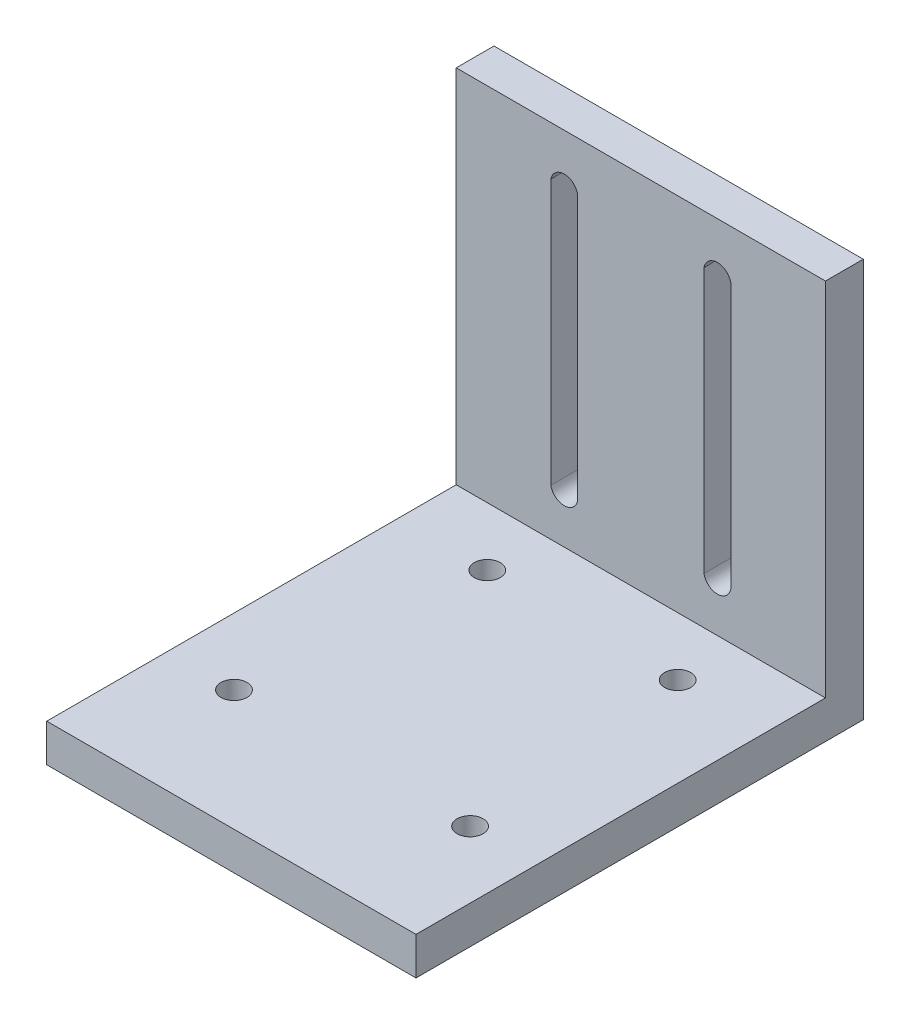
ISO-10303-21;
HEADER;
FILE_DESCRIPTION(('STEP AP214'),'2;1');
FILE_NAME('part.step','',(''),(''),'','','');
FILE_SCHEMA(('AUTOMOTIVE_DESIGN { 1 0 10303 214 1 1 1 1 }'));
ENDSEC;
DATA;
#1=APPLICATION_CONTEXT('core data for automotive mechanical design processes');
#2=APPLICATION_PROTOCOL_DEFINITION('international standard','automotive_design',2000,#1);
#3=PRODUCT_CONTEXT('',#1,'mechanical');
#4=PRODUCT('Part','Part','',(#3));
#5=PRODUCT_RELATED_PRODUCT_CATEGORY('part','',(#4));
#6=PRODUCT_DEFINITION_FORMATION('','',#4);
#7=PRODUCT_DEFINITION_CONTEXT('part definition',#1,'design');
#8=PRODUCT_DEFINITION('design','',#6,#7);
#9=PRODUCT_DEFINITION_SHAPE('','',#8);
#10=(LENGTH_UNIT() NAMED_UNIT(*) SI_UNIT(.MILLI.,.METRE.));
#11=(NAMED_UNIT(*) PLANE_ANGLE_UNIT() SI_UNIT($,.RADIAN.));
#12=(NAMED_UNIT(*) SI_UNIT($,.STERADIAN.) SOLID_ANGLE_UNIT());
#13=UNCERTAINTY_MEASURE_WITH_UNIT(LENGTH_MEASURE(1.E-05),#10,'distance_accuracy_value','');
#14=(GEOMETRIC_REPRESENTATION_CONTEXT(3) GLOBAL_UNCERTAINTY_ASSIGNED_CONTEXT((#13)) GLOBAL_UNIT_ASSIGNED_CONTEXT((#10,
#11,#12)) REPRESENTATION_CONTEXT('',''));
#15=CARTESIAN_POINT('',(0.,0.,0.));
#16=DIRECTION('',(0.,0.,1.));
#17=DIRECTION('',(1.,0.,0.));
#18=AXIS2_PLACEMENT_3D('',#15,#16,#17);
#19=CARTESIAN_POINT('',(47.755227938521,-53.3716256872175,0.));
#20=DIRECTION('',(0.,-1.,0.));
#21=DIRECTION('',(0.,0.,-1.));
#22=AXIS2_PLACEMENT_3D('',#19,#20,#21);
#23=PLANE('',#22);
#24=CARTESIAN_POINT('',(32.4930558770421,-53.3716256872175,16.4089091311071));
#25=DIRECTION('',(0.,-1.,0.));
#26=DIRECTION('',(0.,0.,-1.));
#27=AXIS2_PLACEMENT_3D('',#24,#25,#26);
#28=CIRCLE('',#27,2.22249999999999);
#29=CARTESIAN_POINT('',(32.4930558770421,-53.3716256872175,14.1864091311071));
#30=VERTEX_POINT('',#29);
#31=EDGE_CURVE('E266',#30,#30,#28,.T.);
#32=ORIENTED_EDGE('',*,*,#31,.F.);
#33=EDGE_LOOP('',(#32));
#34=FACE_BOUND('',#33,.T.);
#35=CARTESIAN_POINT('',(0.,-53.3716256872175,16.4089091311071));
#36=DIRECTION('',(0.,-1.,0.));
#37=DIRECTION('',(0.,0.,-1.));
#38=AXIS2_PLACEMENT_3D('',#35,#36,#37);
#39=CIRCLE('',#38,2.22249999999999);
#40=CARTESIAN_POINT('',(0.,-53.3716256872175,14.1864091311071));
#41=VERTEX_POINT('',#40);
#42=EDGE_CURVE('E256',#41,#41,#39,.T.);
#43=ORIENTED_EDGE('',*,*,#42,.F.);
#44=EDGE_LOOP('',(#43));
#45=FACE_BOUND('',#44,.T.);
#46=CARTESIAN_POINT('',(36.3919985441629,-53.3716256872175,55.7350802838838));
#47=DIRECTION('',(0.,-1.,0.));
#48=DIRECTION('',(0.,0.,-1.));
#49=AXIS2_PLACEMENT_3D('',#46,#47,#48);
#50=CIRCLE('',#49,2.22249999999999);
#51=CARTESIAN_POINT('',(36.3919985441629,-53.3716256872175,53.5125802838838));
#52=VERTEX_POINT('',#51);
#53=EDGE_CURVE('E253',#52,#52,#50,.T.);
#54=ORIENTED_EDGE('',*,*,#53,.F.);
#55=EDGE_LOOP('',(#54));
#56=FACE_BOUND('',#55,.T.);
#57=CARTESIAN_POINT('',(-3.89894266712081,-53.3716256872175,55.7350802838838));
#58=DIRECTION('',(0.,-1.,0.));
#59=DIRECTION('',(0.,0.,-1.));
#60=AXIS2_PLACEMENT_3D('',#57,#58,#59);
#61=CIRCLE('',#60,2.22249999999999);
#62=CARTESIAN_POINT('',(-3.89894266712081,-53.3716256872175,53.5125802838838));
#63=VERTEX_POINT('',#62);
#64=EDGE_CURVE('E250',#63,#63,#61,.T.);
#65=ORIENTED_EDGE('',*,*,#64,.F.);
#66=EDGE_LOOP('',(#65));
#67=FACE_BOUND('',#66,.T.);
#68=DIRECTION('',(0.,0.,1.));
#69=VECTOR('',#68,1.);
#70=CARTESIAN_POINT('',(-15.262172061479,-53.3716256872175,0.));
#71=LINE('',#70,#69);
#72=CARTESIAN_POINT('',(-15.262172061479,-53.3716256872175,0.));
#73=VERTEX_POINT('',#72);
#74=CARTESIAN_POINT('',(-15.262172061479,-53.3716256872175,76.327));
#75=VERTEX_POINT('',#74);
#76=EDGE_CURVE('E209',#73,#75,#71,.T.);
#77=ORIENTED_EDGE('',*,*,#76,.F.);
#78=DIRECTION('',(-1.,0.,0.));
#79=VECTOR('',#78,1.);
#80=CARTESIAN_POINT('',(47.755227938521,-53.3716256872175,0.));
#81=LINE('',#80,#79);
#82=CARTESIAN_POINT('',(47.755227938521,-53.3716256872175,0.));
#83=VERTEX_POINT('',#82);
#84=EDGE_CURVE('E236',#83,#73,#81,.T.);
#85=ORIENTED_EDGE('',*,*,#84,.F.);
#86=DIRECTION('',(0.,0.,1.));
#87=VECTOR('',#86,1.);
#88=CARTESIAN_POINT('',(47.755227938521,-53.3716256872175,0.));
#89=LINE('',#88,#87);
#90=CARTESIAN_POINT('',(47.755227938521,-53.3716256872175,76.327));
#91=VERTEX_POINT('',#90);
#92=EDGE_CURVE('E214',#83,#91,#89,.T.);
#93=ORIENTED_EDGE('',*,*,#92,.T.);
#94=DIRECTION('',(-1.,0.,0.));
#95=VECTOR('',#94,1.);
#96=CARTESIAN_POINT('',(47.755227938521,-53.3716256872175,76.327));
#97=LINE('',#96,#95);
#98=EDGE_CURVE('E226',#91,#75,#97,.T.);
#99=ORIENTED_EDGE('',*,*,#98,.T.);
#100=EDGE_LOOP('',(#77,#85,#93,#99));
#101=FACE_BOUND('',#100,.T.);
#102=ADVANCED_FACE('F33',(#34,#45,#56,#67,#101),#23,.T.);
#103=CARTESIAN_POINT('',(47.755227938521,14.7003743127826,0.));
#104=DIRECTION('',(0.,0.,-1.));
#105=DIRECTION('',(-1.,0.,0.));
#106=AXIS2_PLACEMENT_3D('',#103,#104,#105);
#107=PLANE('',#106);
#108=CARTESIAN_POINT('',(29.317008100435,-38.4720184825163,0.));
#109=DIRECTION('',(0.,0.,-1.));
#110=DIRECTION('',(-1.,0.,0.));
#111=AXIS2_PLACEMENT_3D('',#108,#109,#110);
#112=CIRCLE('',#111,2.32660720470115);
#113=CARTESIAN_POINT('',(31.600827938521,-38.9161671424626,0.));
#114=VERTEX_POINT('',#113);
#115=CARTESIAN_POINT('',(27.028827938521,-38.8931272945715,0.));
#116=VERTEX_POINT('',#115);
#117=EDGE_CURVE('E49',#114,#116,#112,.T.);
#118=ORIENTED_EDGE('',*,*,#117,.F.);
#119=DIRECTION('',(0.,-1.,0.));
#120=VECTOR('',#119,1.);
#121=CARTESIAN_POINT('',(31.600827938521,6.34091678949513,0.));
#122=LINE('',#121,#120);
#123=CARTESIAN_POINT('',(31.600827938521,6.34091678949513,0.));
#124=VERTEX_POINT('',#123);
#125=EDGE_CURVE('E154',#124,#114,#122,.T.);
#126=ORIENTED_EDGE('',*,*,#125,.F.);
#127=CARTESIAN_POINT('',(29.317008100435,5.89676812954887,0.));
#128=DIRECTION('',(0.,0.,-1.));
#129=DIRECTION('',(-1.,0.,0.));
#130=AXIS2_PLACEMENT_3D('',#127,#128,#129);
#131=CIRCLE('',#130,2.32660720470115);
#132=CARTESIAN_POINT('',(27.028827938521,6.317876941604,0.));
#133=VERTEX_POINT('',#132);
#134=EDGE_CURVE('E138',#133,#124,#131,.T.);
#135=ORIENTED_EDGE('',*,*,#134,.F.);
#136=DIRECTION('',(0.,1.,0.));
#137=VECTOR('',#136,1.);
#138=CARTESIAN_POINT('',(27.028827938521,-38.8931272945715,0.));
#139=LINE('',#138,#137);
#140=EDGE_CURVE('E147',#116,#133,#139,.T.);
#141=ORIENTED_EDGE('',*,*,#140,.F.);
#142=EDGE_LOOP('',(#118,#126,#135,#141));
#143=FACE_BOUND('',#142,.T.);
#144=CARTESIAN_POINT('',(3.17604777660701,-38.4720184825163,0.));
#145=DIRECTION('',(0.,0.,1.));
#146=DIRECTION('',(1.,0.,0.));
#147=AXIS2_PLACEMENT_3D('',#144,#145,#146);
#148=CIRCLE('',#147,2.32660720470115);
#149=CARTESIAN_POINT('',(0.892227938521022,-38.9161671424626,0.));
#150=VERTEX_POINT('',#149);
#151=CARTESIAN_POINT('',(5.46422793852102,-38.8931272945714,0.));
#152=VERTEX_POINT('',#151);
#153=EDGE_CURVE('E164',#150,#152,#148,.T.);
#154=ORIENTED_EDGE('',*,*,#153,.T.);
#155=DIRECTION('',(0.,1.,0.));
#156=VECTOR('',#155,1.);
#157=CARTESIAN_POINT('',(5.46422793852102,-38.8931272945714,0.));
#158=LINE('',#157,#156);
#159=CARTESIAN_POINT('',(5.46422793852103,6.31787694160393,0.));
#160=VERTEX_POINT('',#159);
#161=EDGE_CURVE('E167',#152,#160,#158,.T.);
#162=ORIENTED_EDGE('',*,*,#161,.T.);
#163=CARTESIAN_POINT('',(3.17604777660701,5.89676812954887,0.));
#164=DIRECTION('',(0.,0.,1.));
#165=DIRECTION('',(1.,0.,0.));
#166=AXIS2_PLACEMENT_3D('',#163,#164,#165);
#167=CIRCLE('',#166,2.32660720470115);
#168=CARTESIAN_POINT('',(0.892227938521008,6.34091678949521,0.));
#169=VERTEX_POINT('',#168);
#170=EDGE_CURVE('E171',#160,#169,#167,.T.);
#171=ORIENTED_EDGE('',*,*,#170,.T.);
#172=DIRECTION('',(0.,-1.,0.));
#173=VECTOR('',#172,1.);
#174=CARTESIAN_POINT('',(0.892227938521008,6.34091678949521,0.));
#175=LINE('',#174,#173);
#176=EDGE_CURVE('E174',#169,#150,#175,.T.);
#177=ORIENTED_EDGE('',*,*,#176,.T.);
#178=EDGE_LOOP('',(#154,#162,#171,#177));
#179=FACE_BOUND('',#178,.T.);
#180=DIRECTION('',(0.,-1.,0.));
#181=VECTOR('',#180,1.);
#182=CARTESIAN_POINT('',(-15.262172061479,14.7003743127826,0.));
#183=LINE('',#182,#181);
#184=CARTESIAN_POINT('',(-15.262172061479,14.7003743127826,0.));
#185=VERTEX_POINT('',#184);
#186=EDGE_CURVE('E218',#185,#73,#183,.T.);
#187=ORIENTED_EDGE('',*,*,#186,.F.);
#188=DIRECTION('',(-1.,0.,0.));
#189=VECTOR('',#188,1.);
#190=CARTESIAN_POINT('',(47.755227938521,14.7003743127826,0.));
#191=LINE('',#190,#189);
#192=CARTESIAN_POINT('',(47.755227938521,14.7003743127826,0.));
#193=VERTEX_POINT('',#192);
#194=EDGE_CURVE('E239',#193,#185,#191,.T.);
#195=ORIENTED_EDGE('',*,*,#194,.F.);
#196=DIRECTION('',(0.,-1.,0.));
#197=VECTOR('',#196,1.);
#198=CARTESIAN_POINT('',(47.755227938521,14.7003743127826,0.));
#199=LINE('',#198,#197);
#200=EDGE_CURVE('E223',#193,#83,#199,.T.);
#201=ORIENTED_EDGE('',*,*,#200,.T.);
#202=ORIENTED_EDGE('',*,*,#84,.T.);
#203=EDGE_LOOP('',(#187,#195,#201,#202));
#204=FACE_BOUND('',#203,.T.);
#205=ADVANCED_FACE('F151',(#143,#179,#204),#107,.T.);
#206=CARTESIAN_POINT('',(47.755227938521,14.7003743127826,76.327));
#207=DIRECTION('',(0.,1.,0.));
#208=DIRECTION('',(0.,0.,1.));
#209=AXIS2_PLACEMENT_3D('',#206,#207,#208);
#210=PLANE('',#209);
#211=DIRECTION('',(1.,0.,0.));
#212=VECTOR('',#211,1.);
#213=CARTESIAN_POINT('',(-15.262172061479,14.7003743127826,6.4516));
#214=LINE('',#213,#212);
#215=CARTESIAN_POINT('',(-15.262172061479,14.7003743127826,6.45160000000003));
#216=VERTEX_POINT('',#215);
#217=CARTESIAN_POINT('',(47.755227938521,14.7003743127826,6.4516));
#218=VERTEX_POINT('',#217);
#219=EDGE_CURVE('E210',#216,#218,#214,.T.);
#220=ORIENTED_EDGE('',*,*,#219,.T.);
#221=DIRECTION('',(0.,0.,-1.));
#222=VECTOR('',#221,1.);
#223=CARTESIAN_POINT('',(47.755227938521,14.7003743127826,76.327));
#224=LINE('',#223,#222);
#225=EDGE_CURVE('E221',#218,#193,#224,.T.);
#226=ORIENTED_EDGE('',*,*,#225,.T.);
#227=ORIENTED_EDGE('',*,*,#194,.T.);
#228=DIRECTION('',(0.,0.,-1.));
#229=VECTOR('',#228,1.);
#230=CARTESIAN_POINT('',(-15.262172061479,14.7003743127826,76.327));
#231=LINE('',#230,#229);
#232=EDGE_CURVE('E232',#216,#185,#231,.T.);
#233=ORIENTED_EDGE('',*,*,#232,.F.);
#234=EDGE_LOOP('',(#220,#226,#227,#233));
#235=FACE_BOUND('',#234,.T.);
#236=ADVANCED_FACE('F303',(#235),#210,.T.);
#237=CARTESIAN_POINT('',(47.755227938521,-53.3716256872175,76.327));
#238=DIRECTION('',(0.,0.,1.));
#239=DIRECTION('',(1.,0.,0.));
#240=AXIS2_PLACEMENT_3D('',#237,#238,#239);
#241=PLANE('',#240);
#242=DIRECTION('',(1.,0.,0.));
#243=VECTOR('',#242,1.);
#244=CARTESIAN_POINT('',(-15.262172061479,-46.9200256872175,76.327));
#245=LINE('',#244,#243);
#246=CARTESIAN_POINT('',(-15.262172061479,-46.9200256872175,76.327));
#247=VERTEX_POINT('',#246);
#248=CARTESIAN_POINT('',(47.755227938521,-46.9200256872175,76.327));
#249=VERTEX_POINT('',#248);
#250=EDGE_CURVE('E207',#247,#249,#245,.T.);
#251=ORIENTED_EDGE('',*,*,#250,.F.);
#252=DIRECTION('',(0.,1.,0.));
#253=VECTOR('',#252,1.);
#254=CARTESIAN_POINT('',(-15.262172061479,-53.3716256872175,76.327));
#255=LINE('',#254,#253);
#256=EDGE_CURVE('E229',#75,#247,#255,.T.);
#257=ORIENTED_EDGE('',*,*,#256,.F.);
#258=ORIENTED_EDGE('',*,*,#98,.F.);
#259=DIRECTION('',(0.,1.,0.));
#260=VECTOR('',#259,1.);
#261=CARTESIAN_POINT('',(47.755227938521,-53.3716256872175,76.327));
#262=LINE('',#261,#260);
#263=EDGE_CURVE('E217',#91,#249,#262,.T.);
#264=ORIENTED_EDGE('',*,*,#263,.T.);
#265=EDGE_LOOP('',(#251,#257,#258,#264));
#266=FACE_BOUND('',#265,.T.);
#267=ADVANCED_FACE('F296',(#266),#241,.T.);
#268=CARTESIAN_POINT('',(47.755227938521,-53.3716256872175,76.327));
#269=DIRECTION('',(-1.,0.,0.));
#270=DIRECTION('',(0.,0.,1.));
#271=AXIS2_PLACEMENT_3D('',#268,#269,#270);
#272=PLANE('',#271);
#273=DIRECTION('',(0.,1.,0.));
#274=VECTOR('',#273,1.);
#275=CARTESIAN_POINT('',(47.755227938521,-46.9200256872175,6.4516));
#276=LINE('',#275,#274);
#277=CARTESIAN_POINT('',(47.755227938521,-46.9200256872175,6.4516));
#278=VERTEX_POINT('',#277);
#279=EDGE_CURVE('E200',#278,#218,#276,.T.);
#280=ORIENTED_EDGE('',*,*,#279,.F.);
#281=DIRECTION('',(0.,0.,-1.));
#282=VECTOR('',#281,1.);
#283=CARTESIAN_POINT('',(47.755227938521,-46.9200256872175,76.327));
#284=LINE('',#283,#282);
#285=EDGE_CURVE('E189',#249,#278,#284,.T.);
#286=ORIENTED_EDGE('',*,*,#285,.F.);
#287=ORIENTED_EDGE('',*,*,#263,.F.);
#288=ORIENTED_EDGE('',*,*,#92,.F.);
#289=ORIENTED_EDGE('',*,*,#200,.F.);
#290=ORIENTED_EDGE('',*,*,#225,.F.);
#291=EDGE_LOOP('',(#280,#286,#287,#288,#289,#290));
#292=FACE_BOUND('',#291,.T.);
#293=ADVANCED_FACE('F291',(#292),#272,.F.);
#294=CARTESIAN_POINT('',(-15.262172061479,-53.3716256872175,76.327));
#295=DIRECTION('',(-1.,0.,0.));
#296=DIRECTION('',(0.,0.,1.));
#297=AXIS2_PLACEMENT_3D('',#294,#295,#296);
#298=PLANE('',#297);
#299=DIRECTION('',(0.,0.,-1.));
#300=VECTOR('',#299,1.);
#301=CARTESIAN_POINT('',(-15.262172061479,-46.9200256872175,76.327));
#302=LINE('',#301,#300);
#303=CARTESIAN_POINT('',(-15.262172061479,-46.9200256872175,6.4516));
#304=VERTEX_POINT('',#303);
#305=EDGE_CURVE('E196',#247,#304,#302,.T.);
#306=ORIENTED_EDGE('',*,*,#305,.T.);
#307=DIRECTION('',(0.,1.,0.));
#308=VECTOR('',#307,1.);
#309=CARTESIAN_POINT('',(-15.262172061479,-46.9200256872175,6.4516));
#310=LINE('',#309,#308);
#311=EDGE_CURVE('E199',#304,#216,#310,.T.);
#312=ORIENTED_EDGE('',*,*,#311,.T.);
#313=ORIENTED_EDGE('',*,*,#232,.T.);
#314=ORIENTED_EDGE('',*,*,#186,.T.);
#315=ORIENTED_EDGE('',*,*,#76,.T.);
#316=ORIENTED_EDGE('',*,*,#256,.T.);
#317=EDGE_LOOP('',(#306,#312,#313,#314,#315,#316));
#318=FACE_BOUND('',#317,.T.);
#319=ADVANCED_FACE('F283',(#318),#298,.T.);
#320=CARTESIAN_POINT('',(-15.262172061479,-46.9200256872175,76.327));
#321=DIRECTION('',(0.,-1.,0.));
#322=DIRECTION('',(1.,0.,0.));
#323=AXIS2_PLACEMENT_3D('',#320,#321,#322);
#324=PLANE('',#323);
#325=CARTESIAN_POINT('',(32.4930558770421,-46.9200256872175,16.4089091311071));
#326=DIRECTION('',(0.,-1.,0.));
#327=DIRECTION('',(1.,0.,0.));
#328=AXIS2_PLACEMENT_3D('',#325,#326,#327);
#329=CIRCLE('',#328,2.22249999999999);
#330=CARTESIAN_POINT('',(34.7155558770421,-46.9200256872175,16.4089091311071));
#331=VERTEX_POINT('',#330);
#332=EDGE_CURVE('E36',#331,#331,#329,.T.);
#333=ORIENTED_EDGE('',*,*,#332,.T.);
#334=EDGE_LOOP('',(#333));
#335=FACE_BOUND('',#334,.T.);
#336=CARTESIAN_POINT('',(0.,-46.9200256872175,16.4089091311071));
#337=DIRECTION('',(0.,-1.,0.));
#338=DIRECTION('',(1.,0.,0.));
#339=AXIS2_PLACEMENT_3D('',#336,#337,#338);
#340=CIRCLE('',#339,2.22249999999999);
#341=CARTESIAN_POINT('',(2.22249999999998,-46.9200256872175,16.4089091311071));
#342=VERTEX_POINT('',#341);
#343=EDGE_CURVE('E254',#342,#342,#340,.T.);
#344=ORIENTED_EDGE('',*,*,#343,.T.);
#345=EDGE_LOOP('',(#344));
#346=FACE_BOUND('',#345,.T.);
#347=CARTESIAN_POINT('',(36.3919985441629,-46.9200256872175,55.7350802838838));
#348=DIRECTION('',(0.,-1.,0.));
#349=DIRECTION('',(1.,0.,0.));
#350=AXIS2_PLACEMENT_3D('',#347,#348,#349);
#351=CIRCLE('',#350,2.22249999999999);
#352=CARTESIAN_POINT('',(38.6144985441629,-46.9200256872175,55.7350802838838));
#353=VERTEX_POINT('',#352);
#354=EDGE_CURVE('E251',#353,#353,#351,.T.);
#355=ORIENTED_EDGE('',*,*,#354,.T.);
#356=EDGE_LOOP('',(#355));
#357=FACE_BOUND('',#356,.T.);
#358=CARTESIAN_POINT('',(-3.89894266712081,-46.9200256872175,55.7350802838838));
#359=DIRECTION('',(0.,-1.,0.));
#360=DIRECTION('',(1.,0.,0.));
#361=AXIS2_PLACEMENT_3D('',#358,#359,#360);
#362=CIRCLE('',#361,2.22249999999999);
#363=CARTESIAN_POINT('',(-1.67644266712083,-46.9200256872175,55.7350802838838));
#364=VERTEX_POINT('',#363);
#365=EDGE_CURVE('E247',#364,#364,#362,.T.);
#366=ORIENTED_EDGE('',*,*,#365,.T.);
#367=EDGE_LOOP('',(#366));
#368=FACE_BOUND('',#367,.T.);
#369=ORIENTED_EDGE('',*,*,#285,.T.);
#370=DIRECTION('',(1.,0.,0.));
#371=VECTOR('',#370,1.);
#372=CARTESIAN_POINT('',(-15.262172061479,-46.9200256872175,6.4516));
#373=LINE('',#372,#371);
#374=EDGE_CURVE('E203',#304,#278,#373,.T.);
#375=ORIENTED_EDGE('',*,*,#374,.F.);
#376=ORIENTED_EDGE('',*,*,#305,.F.);
#377=ORIENTED_EDGE('',*,*,#250,.T.);
#378=EDGE_LOOP('',(#369,#375,#376,#377));
#379=FACE_BOUND('',#378,.T.);
#380=ADVANCED_FACE('F299',(#335,#346,#357,#368,#379),#324,.F.);
#381=CARTESIAN_POINT('',(-15.262172061479,-46.9200256872175,6.4516));
#382=DIRECTION('',(0.,0.,-1.));
#383=DIRECTION('',(-1.,0.,0.));
#384=AXIS2_PLACEMENT_3D('',#381,#382,#383);
#385=PLANE('',#384);
#386=DIRECTION('',(0.,-1.,0.));
#387=VECTOR('',#386,1.);
#388=CARTESIAN_POINT('',(31.600827938521,-46.9200256872175,6.4516));
#389=LINE('',#388,#387);
#390=CARTESIAN_POINT('',(31.600827938521,6.34091678949513,6.45160000000003));
#391=VERTEX_POINT('',#390);
#392=CARTESIAN_POINT('',(31.600827938521,-38.9161671424626,6.45160000000003));
#393=VERTEX_POINT('',#392);
#394=EDGE_CURVE('E41',#391,#393,#389,.T.);
#395=ORIENTED_EDGE('',*,*,#394,.T.);
#396=CARTESIAN_POINT('',(29.317008100435,-38.4720184825163,6.4516));
#397=DIRECTION('',(0.,0.,-1.));
#398=DIRECTION('',(-1.,0.,0.));
#399=AXIS2_PLACEMENT_3D('',#396,#397,#398);
#400=CIRCLE('',#399,2.32660720470115);
#401=CARTESIAN_POINT('',(27.028827938521,-38.8931272945715,6.45160000000003));
#402=VERTEX_POINT('',#401);
#403=EDGE_CURVE('E11',#393,#402,#400,.T.);
#404=ORIENTED_EDGE('',*,*,#403,.T.);
#405=DIRECTION('',(0.,1.,0.));
#406=VECTOR('',#405,1.);
#407=CARTESIAN_POINT('',(27.028827938521,-46.9200256872175,6.4516));
#408=LINE('',#407,#406);
#409=CARTESIAN_POINT('',(27.028827938521,6.317876941604,6.4516));
#410=VERTEX_POINT('',#409);
#411=EDGE_CURVE('E238',#402,#410,#408,.T.);
#412=ORIENTED_EDGE('',*,*,#411,.T.);
#413=CARTESIAN_POINT('',(29.317008100435,5.89676812954887,6.4516));
#414=DIRECTION('',(0.,0.,-1.));
#415=DIRECTION('',(-1.,0.,0.));
#416=AXIS2_PLACEMENT_3D('',#413,#414,#415);
#417=CIRCLE('',#416,2.32660720470115);
#418=EDGE_CURVE('E141',#410,#391,#417,.T.);
#419=ORIENTED_EDGE('',*,*,#418,.T.);
#420=EDGE_LOOP('',(#395,#404,#412,#419));
#421=FACE_BOUND('',#420,.T.);
#422=DIRECTION('',(0.,1.,0.));
#423=VECTOR('',#422,1.);
#424=CARTESIAN_POINT('',(5.46422793852102,-38.8931272945714,6.4516));
#425=LINE('',#424,#423);
#426=CARTESIAN_POINT('',(5.46422793852102,-38.8931272945714,6.4516));
#427=VERTEX_POINT('',#426);
#428=CARTESIAN_POINT('',(5.46422793852103,6.31787694160393,6.4516));
#429=VERTEX_POINT('',#428);
#430=EDGE_CURVE('E179',#427,#429,#425,.T.);
#431=ORIENTED_EDGE('',*,*,#430,.F.);
#432=CARTESIAN_POINT('',(3.17604777660701,-38.4720184825163,6.4516));
#433=DIRECTION('',(0.,0.,1.));
#434=DIRECTION('',(1.,0.,0.));
#435=AXIS2_PLACEMENT_3D('',#432,#433,#434);
#436=CIRCLE('',#435,2.32660720470115);
#437=CARTESIAN_POINT('',(0.892227938521022,-38.9161671424626,6.4516));
#438=VERTEX_POINT('',#437);
#439=EDGE_CURVE('E161',#438,#427,#436,.T.);
#440=ORIENTED_EDGE('',*,*,#439,.F.);
#441=DIRECTION('',(0.,-1.,0.));
#442=VECTOR('',#441,1.);
#443=CARTESIAN_POINT('',(0.892227938521008,6.34091678949521,6.4516));
#444=LINE('',#443,#442);
#445=CARTESIAN_POINT('',(0.892227938521008,6.34091678949521,6.4516));
#446=VERTEX_POINT('',#445);
#447=EDGE_CURVE('E168',#446,#438,#444,.T.);
#448=ORIENTED_EDGE('',*,*,#447,.F.);
#449=CARTESIAN_POINT('',(3.17604777660701,5.89676812954887,6.4516));
#450=DIRECTION('',(0.,0.,1.));
#451=DIRECTION('',(1.,0.,0.));
#452=AXIS2_PLACEMENT_3D('',#449,#450,#451);
#453=CIRCLE('',#452,2.32660720470115);
#454=EDGE_CURVE('E182',#429,#446,#453,.T.);
#455=ORIENTED_EDGE('',*,*,#454,.F.);
#456=EDGE_LOOP('',(#431,#440,#448,#455));
#457=FACE_BOUND('',#456,.T.);
#458=ORIENTED_EDGE('',*,*,#279,.T.);
#459=ORIENTED_EDGE('',*,*,#219,.F.);
#460=ORIENTED_EDGE('',*,*,#311,.F.);
#461=ORIENTED_EDGE('',*,*,#374,.T.);
#462=EDGE_LOOP('',(#458,#459,#460,#461));
#463=FACE_BOUND('',#462,.T.);
#464=ADVANCED_FACE('F301',(#421,#457,#463),#385,.F.);
#465=CARTESIAN_POINT('',(3.17604777660701,-38.4720184825163,0.));
#466=DIRECTION('',(0.,0.,1.));
#467=DIRECTION('',(1.,0.,0.));
#468=AXIS2_PLACEMENT_3D('',#465,#466,#467);
#469=CYLINDRICAL_SURFACE('',#468,2.32660720470115);
#470=ORIENTED_EDGE('',*,*,#439,.T.);
#471=DIRECTION('',(0.,0.,1.));
#472=VECTOR('',#471,1.);
#473=CARTESIAN_POINT('',(5.46422793852102,-38.8931272945714,0.));
#474=LINE('',#473,#472);
#475=EDGE_CURVE('E177',#152,#427,#474,.T.);
#476=ORIENTED_EDGE('',*,*,#475,.F.);
#477=ORIENTED_EDGE('',*,*,#153,.F.);
#478=DIRECTION('',(0.,0.,1.));
#479=VECTOR('',#478,1.);
#480=CARTESIAN_POINT('',(0.892227938521022,-38.9161671424626,0.));
#481=LINE('',#480,#479);
#482=EDGE_CURVE('E187',#150,#438,#481,.T.);
#483=ORIENTED_EDGE('',*,*,#482,.T.);
#484=EDGE_LOOP('',(#470,#476,#477,#483));
#485=FACE_BOUND('',#484,.T.);
#486=ADVANCED_FACE('F321',(#485),#469,.F.);
#487=CARTESIAN_POINT('',(0.892227938521008,6.34091678949521,0.));
#488=DIRECTION('',(-1.,0.,0.));
#489=DIRECTION('',(0.,-1.,0.));
#490=AXIS2_PLACEMENT_3D('',#487,#488,#489);
#491=PLANE('',#490);
#492=ORIENTED_EDGE('',*,*,#447,.T.);
#493=ORIENTED_EDGE('',*,*,#482,.F.);
#494=ORIENTED_EDGE('',*,*,#176,.F.);
#495=DIRECTION('',(0.,0.,1.));
#496=VECTOR('',#495,1.);
#497=CARTESIAN_POINT('',(0.892227938521008,6.34091678949521,0.));
#498=LINE('',#497,#496);
#499=EDGE_CURVE('E190',#169,#446,#498,.T.);
#500=ORIENTED_EDGE('',*,*,#499,.T.);
#501=EDGE_LOOP('',(#492,#493,#494,#500));
#502=FACE_BOUND('',#501,.T.);
#503=ADVANCED_FACE('F325',(#502),#491,.F.);
#504=CARTESIAN_POINT('',(3.17604777660701,5.89676812954887,0.));
#505=DIRECTION('',(0.,0.,1.));
#506=DIRECTION('',(1.,0.,0.));
#507=AXIS2_PLACEMENT_3D('',#504,#505,#506);
#508=CYLINDRICAL_SURFACE('',#507,2.32660720470115);
#509=ORIENTED_EDGE('',*,*,#454,.T.);
#510=ORIENTED_EDGE('',*,*,#499,.F.);
#511=ORIENTED_EDGE('',*,*,#170,.F.);
#512=DIRECTION('',(0.,0.,1.));
#513=VECTOR('',#512,1.);
#514=CARTESIAN_POINT('',(5.46422793852103,6.31787694160393,0.));
#515=LINE('',#514,#513);
#516=EDGE_CURVE('E192',#160,#429,#515,.T.);
#517=ORIENTED_EDGE('',*,*,#516,.T.);
#518=EDGE_LOOP('',(#509,#510,#511,#517));
#519=FACE_BOUND('',#518,.T.);
#520=ADVANCED_FACE('F331',(#519),#508,.F.);
#521=CARTESIAN_POINT('',(5.46422793852102,-38.8931272945714,0.));
#522=DIRECTION('',(1.,0.,0.));
#523=DIRECTION('',(0.,1.,0.));
#524=AXIS2_PLACEMENT_3D('',#521,#522,#523);
#525=PLANE('',#524);
#526=ORIENTED_EDGE('',*,*,#430,.T.);
#527=ORIENTED_EDGE('',*,*,#516,.F.);
#528=ORIENTED_EDGE('',*,*,#161,.F.);
#529=ORIENTED_EDGE('',*,*,#475,.T.);
#530=EDGE_LOOP('',(#526,#527,#528,#529));
#531=FACE_BOUND('',#530,.T.);
#532=ADVANCED_FACE('F327',(#531),#525,.F.);
#533=CARTESIAN_POINT('',(29.317008100435,-38.4720184825163,76.327));
#534=DIRECTION('',(0.,0.,-1.));
#535=DIRECTION('',(-1.,0.,0.));
#536=AXIS2_PLACEMENT_3D('',#533,#534,#535);
#537=CYLINDRICAL_SURFACE('',#536,2.32660720470115);
#538=DIRECTION('',(0.,0.,-1.));
#539=VECTOR('',#538,1.);
#540=CARTESIAN_POINT('',(31.600827938521,-38.9161671424626,76.327));
#541=LINE('',#540,#539);
#542=EDGE_CURVE('E159',#393,#114,#541,.T.);
#543=ORIENTED_EDGE('',*,*,#542,.T.);
#544=ORIENTED_EDGE('',*,*,#117,.T.);
#545=DIRECTION('',(0.,0.,-1.));
#546=VECTOR('',#545,1.);
#547=CARTESIAN_POINT('',(27.028827938521,-38.8931272945715,76.327));
#548=LINE('',#547,#546);
#549=EDGE_CURVE('E144',#402,#116,#548,.T.);
#550=ORIENTED_EDGE('',*,*,#549,.F.);
#551=ORIENTED_EDGE('',*,*,#403,.F.);
#552=EDGE_LOOP('',(#543,#544,#550,#551));
#553=FACE_BOUND('',#552,.T.);
#554=ADVANCED_FACE('F330',(#553),#537,.F.);
#555=CARTESIAN_POINT('',(31.600827938521,6.34091678949513,76.327));
#556=DIRECTION('',(1.,0.,0.));
#557=DIRECTION('',(0.,1.,0.));
#558=AXIS2_PLACEMENT_3D('',#555,#556,#557);
#559=PLANE('',#558);
#560=DIRECTION('',(0.,0.,-1.));
#561=VECTOR('',#560,1.);
#562=CARTESIAN_POINT('',(31.600827938521,6.34091678949513,76.327));
#563=LINE('',#562,#561);
#564=EDGE_CURVE('E143',#391,#124,#563,.T.);
#565=ORIENTED_EDGE('',*,*,#564,.T.);
#566=ORIENTED_EDGE('',*,*,#125,.T.);
#567=ORIENTED_EDGE('',*,*,#542,.F.);
#568=ORIENTED_EDGE('',*,*,#394,.F.);
#569=EDGE_LOOP('',(#565,#566,#567,#568));
#570=FACE_BOUND('',#569,.T.);
#571=ADVANCED_FACE('F341',(#570),#559,.F.);
#572=CARTESIAN_POINT('',(29.317008100435,5.89676812954887,76.327));
#573=DIRECTION('',(0.,0.,-1.));
#574=DIRECTION('',(-1.,0.,0.));
#575=AXIS2_PLACEMENT_3D('',#572,#573,#574);
#576=CYLINDRICAL_SURFACE('',#575,2.32660720470115);
#577=DIRECTION('',(0.,0.,-1.));
#578=VECTOR('',#577,1.);
#579=CARTESIAN_POINT('',(27.028827938521,6.317876941604,76.327));
#580=LINE('',#579,#578);
#581=EDGE_CURVE('E57',#410,#133,#580,.T.);
#582=ORIENTED_EDGE('',*,*,#581,.T.);
#583=ORIENTED_EDGE('',*,*,#134,.T.);
#584=ORIENTED_EDGE('',*,*,#564,.F.);
#585=ORIENTED_EDGE('',*,*,#418,.F.);
#586=EDGE_LOOP('',(#582,#583,#584,#585));
#587=FACE_BOUND('',#586,.T.);
#588=ADVANCED_FACE('F135',(#587),#576,.F.);
#589=CARTESIAN_POINT('',(27.028827938521,-38.8931272945715,76.327));
#590=DIRECTION('',(-1.,0.,0.));
#591=DIRECTION('',(0.,-1.,0.));
#592=AXIS2_PLACEMENT_3D('',#589,#590,#591);
#593=PLANE('',#592);
#594=ORIENTED_EDGE('',*,*,#549,.T.);
#595=ORIENTED_EDGE('',*,*,#140,.T.);
#596=ORIENTED_EDGE('',*,*,#581,.F.);
#597=ORIENTED_EDGE('',*,*,#411,.F.);
#598=EDGE_LOOP('',(#594,#595,#596,#597));
#599=FACE_BOUND('',#598,.T.);
#600=ADVANCED_FACE('F148',(#599),#593,.F.);
#601=CARTESIAN_POINT('',(-3.89894266712081,-53.3716256872175,55.7350802838838));
#602=DIRECTION('',(0.,-1.,0.));
#603=DIRECTION('',(0.,0.,-1.));
#604=AXIS2_PLACEMENT_3D('',#601,#602,#603);
#605=CYLINDRICAL_SURFACE('',#604,2.22249999999999);
#606=ORIENTED_EDGE('',*,*,#64,.T.);
#607=EDGE_LOOP('',(#606));
#608=FACE_BOUND('',#607,.T.);
#609=ORIENTED_EDGE('',*,*,#365,.F.);
#610=EDGE_LOOP('',(#609));
#611=FACE_BOUND('',#610,.T.);
#612=ADVANCED_FACE('F272',(#608,#611),#605,.F.);
#613=CARTESIAN_POINT('',(36.3919985441629,-53.3716256872175,55.7350802838838));
#614=DIRECTION('',(0.,-1.,0.));
#615=DIRECTION('',(0.,0.,-1.));
#616=AXIS2_PLACEMENT_3D('',#613,#614,#615);
#617=CYLINDRICAL_SURFACE('',#616,2.22249999999999);
#618=ORIENTED_EDGE('',*,*,#53,.T.);
#619=EDGE_LOOP('',(#618));
#620=FACE_BOUND('',#619,.T.);
#621=ORIENTED_EDGE('',*,*,#354,.F.);
#622=EDGE_LOOP('',(#621));
#623=FACE_BOUND('',#622,.T.);
#624=ADVANCED_FACE('F351',(#620,#623),#617,.F.);
#625=CARTESIAN_POINT('',(0.,-53.3716256872175,16.4089091311071));
#626=DIRECTION('',(0.,-1.,0.));
#627=DIRECTION('',(0.,0.,-1.));
#628=AXIS2_PLACEMENT_3D('',#625,#626,#627);
#629=CYLINDRICAL_SURFACE('',#628,2.22249999999999);
#630=ORIENTED_EDGE('',*,*,#42,.T.);
#631=EDGE_LOOP('',(#630));
#632=FACE_BOUND('',#631,.T.);
#633=ORIENTED_EDGE('',*,*,#343,.F.);
#634=EDGE_LOOP('',(#633));
#635=FACE_BOUND('',#634,.T.);
#636=ADVANCED_FACE('F354',(#632,#635),#629,.F.);
#637=CARTESIAN_POINT('',(32.4930558770421,-53.3716256872175,16.4089091311071));
#638=DIRECTION('',(0.,-1.,0.));
#639=DIRECTION('',(0.,0.,-1.));
#640=AXIS2_PLACEMENT_3D('',#637,#638,#639);
#641=CYLINDRICAL_SURFACE('',#640,2.22249999999999);
#642=ORIENTED_EDGE('',*,*,#31,.T.);
#643=EDGE_LOOP('',(#642));
#644=FACE_BOUND('',#643,.T.);
#645=ORIENTED_EDGE('',*,*,#332,.F.);
#646=EDGE_LOOP('',(#645));
#647=FACE_BOUND('',#646,.T.);
#648=ADVANCED_FACE('F358',(#644,#647),#641,.F.);
#649=CLOSED_SHELL('',(#102,#205,#236,#267,#293,#319,#380,#464,#486,#503,#520,#532,#554,#571,
#588,#600,#612,#624,#636,#648));
#650=MANIFOLD_SOLID_BREP('B2',#649);
#651=ADVANCED_BREP_SHAPE_REPRESENTATION('',(#18,#650),#14);
#652=SHAPE_DEFINITION_REPRESENTATION(#9,#651);
ENDSEC;
END-ISO-10303-21;
